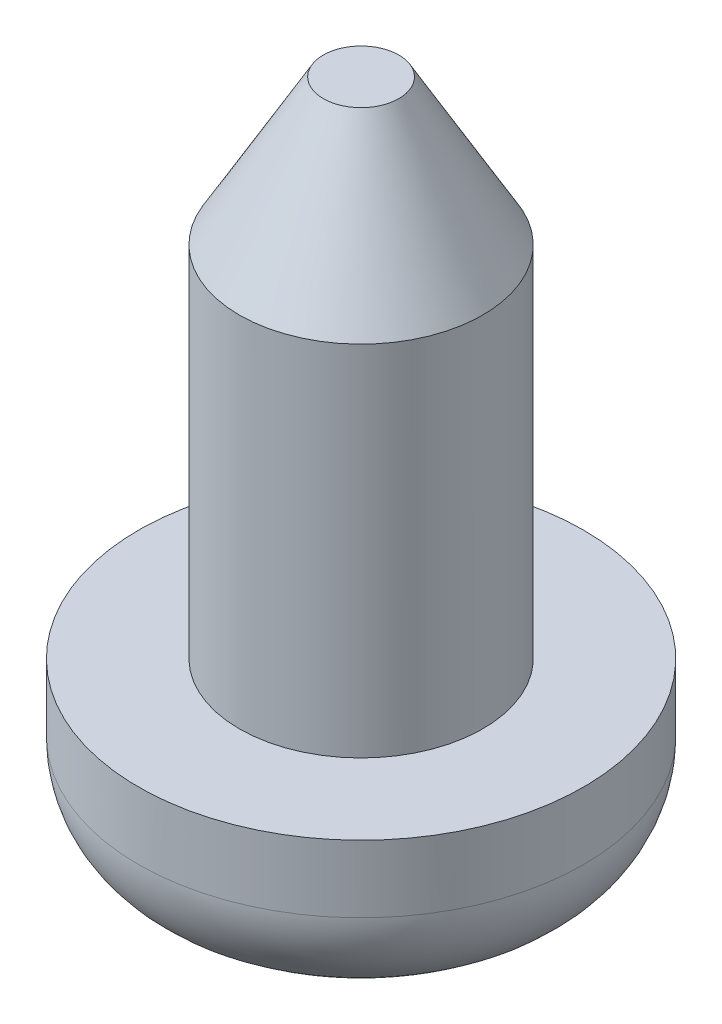
ISO-10303-21;
HEADER;
FILE_DESCRIPTION(('STEP AP214'),'2;1');
FILE_NAME('part.step','',(''),(''),'','','');
FILE_SCHEMA(('AUTOMOTIVE_DESIGN { 1 0 10303 214 1 1 1 1 }'));
ENDSEC;
DATA;
#1=APPLICATION_CONTEXT('core data for automotive mechanical design processes');
#2=APPLICATION_PROTOCOL_DEFINITION('international standard','automotive_design',2000,#1);
#3=PRODUCT_CONTEXT('',#1,'mechanical');
#4=PRODUCT('Part','Part','',(#3));
#5=PRODUCT_RELATED_PRODUCT_CATEGORY('part','',(#4));
#6=PRODUCT_DEFINITION_FORMATION('','',#4);
#7=PRODUCT_DEFINITION_CONTEXT('part definition',#1,'design');
#8=PRODUCT_DEFINITION('design','',#6,#7);
#9=PRODUCT_DEFINITION_SHAPE('','',#8);
#10=(LENGTH_UNIT() NAMED_UNIT(*) SI_UNIT(.MILLI.,.METRE.));
#11=(NAMED_UNIT(*) PLANE_ANGLE_UNIT() SI_UNIT($,.RADIAN.));
#12=(NAMED_UNIT(*) SI_UNIT($,.STERADIAN.) SOLID_ANGLE_UNIT());
#13=UNCERTAINTY_MEASURE_WITH_UNIT(LENGTH_MEASURE(1.E-05),#10,'distance_accuracy_value','');
#14=(GEOMETRIC_REPRESENTATION_CONTEXT(3) GLOBAL_UNCERTAINTY_ASSIGNED_CONTEXT((#13)) GLOBAL_UNIT_ASSIGNED_CONTEXT((#10,
#11,#12)) REPRESENTATION_CONTEXT('',''));
#15=CARTESIAN_POINT('',(0.,0.,0.));
#16=DIRECTION('',(0.,0.,1.));
#17=DIRECTION('',(1.,0.,0.));
#18=AXIS2_PLACEMENT_3D('',#15,#16,#17);
#19=CARTESIAN_POINT('',(-137.429096584287,-127.705426917511,-6.45095762802332));
#20=DIRECTION('',(0.978715860009591,0.,-0.20522004133536));
#21=DIRECTION('',(-0.20522004133536,0.,-0.978715860009591));
#22=AXIS2_PLACEMENT_3D('',#19,#20,#21);
#23=PLANE('',#22);
#24=DIRECTION('',(0.,1.,0.));
#25=VECTOR('',#24,1.);
#26=CARTESIAN_POINT('',(-137.313006597997,-127.705426917511,-5.8973123308491));
#27=LINE('',#26,#25);
#28=CARTESIAN_POINT('',(-137.313006597997,-128.705426917511,-5.89731233084906));
#29=VERTEX_POINT('',#28);
#30=CARTESIAN_POINT('',(-137.313006597997,-127.705426917511,-5.89731233084912));
#31=VERTEX_POINT('',#30);
#32=EDGE_CURVE('E557',#29,#31,#27,.T.);
#33=ORIENTED_EDGE('',*,*,#32,.T.);
#34=DIRECTION('',(-0.205220041333827,0.,-0.978715860009912));
#35=VECTOR('',#34,1.);
#36=CARTESIAN_POINT('',(-137.313006597997,-127.705426917511,-5.89731233084914));
#37=LINE('',#36,#35);
#38=CARTESIAN_POINT('',(-137.429096584287,-127.705426917511,-6.45095762802359));
#39=VERTEX_POINT('',#38);
#40=EDGE_CURVE('E555',#31,#39,#37,.T.);
#41=ORIENTED_EDGE('',*,*,#40,.T.);
#42=DIRECTION('',(0.,1.,0.));
#43=VECTOR('',#42,1.);
#44=CARTESIAN_POINT('',(-137.429096584288,-127.705426917511,-6.45095762802373));
#45=LINE('',#44,#43);
#46=CARTESIAN_POINT('',(-137.429096584287,-128.705426917511,-6.45095762802376));
#47=VERTEX_POINT('',#46);
#48=EDGE_CURVE('E540',#39,#47,#45,.F.);
#49=ORIENTED_EDGE('',*,*,#48,.T.);
#50=DIRECTION('',(-0.205220041333788,0.,-0.978715860009921));
#51=VECTOR('',#50,1.);
#52=CARTESIAN_POINT('',(-137.313006597997,-128.705426917511,-5.89731233084903));
#53=LINE('',#52,#51);
#54=EDGE_CURVE('E547',#29,#47,#53,.T.);
#55=ORIENTED_EDGE('',*,*,#54,.F.);
#56=EDGE_LOOP('',(#33,#41,#49,#55));
#57=FACE_BOUND('',#56,.T.);
#58=ADVANCED_FACE('F17',(#57),#23,.F.);
#59=CARTESIAN_POINT('',(-138.098831867752,-127.705426917511,-6.88851293890647));
#60=DIRECTION('',(-0.205220041335361,0.,-0.978715860009591));
#61=DIRECTION('',(-0.978715860009591,0.,0.205220041335361));
#62=AXIS2_PLACEMENT_3D('',#59,#60,#61);
#63=PLANE('',#62);
#64=DIRECTION('',(0.,1.,0.));
#65=VECTOR('',#64,1.);
#66=CARTESIAN_POINT('',(-138.098831867753,-127.705426917511,-6.8885129389066));
#67=LINE('',#66,#65);
#68=CARTESIAN_POINT('',(-138.098831867752,-128.705426917511,-6.88851293890631));
#69=VERTEX_POINT('',#68);
#70=CARTESIAN_POINT('',(-138.098831867752,-127.705426917511,-6.88851293890656));
#71=VERTEX_POINT('',#70);
#72=EDGE_CURVE('E140',#69,#71,#67,.T.);
#73=ORIENTED_EDGE('',*,*,#72,.T.);
#74=DIRECTION('',(-0.978715860009572,0.,0.205220041335452));
#75=VECTOR('',#74,1.);
#76=CARTESIAN_POINT('',(-138.098831867752,-127.705426917511,-6.88851293890647));
#77=LINE('',#76,#75);
#78=CARTESIAN_POINT('',(-138.652477164926,-127.705426917511,-6.77242295261554));
#79=VERTEX_POINT('',#78);
#80=EDGE_CURVE('E133',#71,#79,#77,.T.);
#81=ORIENTED_EDGE('',*,*,#80,.T.);
#82=DIRECTION('',(0.,1.,0.));
#83=VECTOR('',#82,1.);
#84=CARTESIAN_POINT('',(-138.652477164926,-127.705426917511,-6.77242295261554));
#85=LINE('',#84,#83);
#86=CARTESIAN_POINT('',(-138.652477164926,-128.705426917511,-6.77242295261556));
#87=VERTEX_POINT('',#86);
#88=EDGE_CURVE('E476',#79,#87,#85,.F.);
#89=ORIENTED_EDGE('',*,*,#88,.T.);
#90=DIRECTION('',(-0.978715860009706,0.,0.205220041334811));
#91=VECTOR('',#90,1.);
#92=CARTESIAN_POINT('',(-138.098831867752,-128.705426917511,-6.88851293890616));
#93=LINE('',#92,#91);
#94=EDGE_CURVE('E642',#69,#87,#93,.T.);
#95=ORIENTED_EDGE('',*,*,#94,.F.);
#96=EDGE_LOOP('',(#73,#81,#89,#95));
#97=FACE_BOUND('',#96,.T.);
#98=ADVANCED_FACE('F239',(#97),#63,.F.);
#99=CARTESIAN_POINT('',(-138.973942489519,-127.705426917511,-5.54904237197659));
#100=DIRECTION('',(-0.978715860009591,0.,0.20522004133536));
#101=DIRECTION('',(0.20522004133536,0.,0.978715860009591));
#102=AXIS2_PLACEMENT_3D('',#99,#100,#101);
#103=PLANE('',#102);
#104=DIRECTION('',(0.,1.,0.));
#105=VECTOR('',#104,1.);
#106=CARTESIAN_POINT('',(-139.09003247581,-127.705426917511,-6.10268766915057));
#107=LINE('',#106,#105);
#108=CARTESIAN_POINT('',(-139.09003247581,-128.705426917511,-6.10268766915057));
#109=VERTEX_POINT('',#108);
#110=CARTESIAN_POINT('',(-139.09003247581,-127.705426917511,-6.10268766915057));
#111=VERTEX_POINT('',#110);
#112=EDGE_CURVE('E628',#109,#111,#107,.T.);
#113=ORIENTED_EDGE('',*,*,#112,.T.);
#114=DIRECTION('',(0.20522004133559,0.,0.978715860009543));
#115=VECTOR('',#114,1.);
#116=CARTESIAN_POINT('',(-139.09003247581,-127.705426917511,-6.10268766915057));
#117=LINE('',#116,#115);
#118=CARTESIAN_POINT('',(-138.973942489519,-127.705426917511,-5.54904237197631));
#119=VERTEX_POINT('',#118);
#120=EDGE_CURVE('E598',#111,#119,#117,.T.);
#121=ORIENTED_EDGE('',*,*,#120,.T.);
#122=DIRECTION('',(0.,1.,0.));
#123=VECTOR('',#122,1.);
#124=CARTESIAN_POINT('',(-138.973942489518,-127.705426917511,-5.54904237197617));
#125=LINE('',#124,#123);
#126=CARTESIAN_POINT('',(-138.973942489519,-128.705426917511,-5.54904237197612));
#127=VERTEX_POINT('',#126);
#128=EDGE_CURVE('E392',#119,#127,#125,.F.);
#129=ORIENTED_EDGE('',*,*,#128,.T.);
#130=DIRECTION('',(0.205220041335483,0.,0.978715860009565));
#131=VECTOR('',#130,1.);
#132=CARTESIAN_POINT('',(-139.09003247581,-128.705426917511,-6.10268766915057));
#133=LINE('',#132,#131);
#134=EDGE_CURVE('E412',#109,#127,#133,.T.);
#135=ORIENTED_EDGE('',*,*,#134,.F.);
#136=EDGE_LOOP('',(#113,#121,#129,#135));
#137=FACE_BOUND('',#136,.T.);
#138=ADVANCED_FACE('F236',(#137),#103,.F.);
#139=CARTESIAN_POINT('',(-138.304207206054,-127.705426917511,-5.11148706109297));
#140=DIRECTION('',(0.205220041335361,0.,0.978715860009591));
#141=DIRECTION('',(0.978715860009591,0.,-0.205220041335361));
#142=AXIS2_PLACEMENT_3D('',#139,#140,#141);
#143=PLANE('',#142);
#144=DIRECTION('',(0.,1.,0.));
#145=VECTOR('',#144,1.);
#146=CARTESIAN_POINT('',(-138.304207206054,-127.705426917511,-5.11148706109309));
#147=LINE('',#146,#145);
#148=CARTESIAN_POINT('',(-138.304207206054,-128.705426917511,-5.11148706109301));
#149=VERTEX_POINT('',#148);
#150=CARTESIAN_POINT('',(-138.304207206054,-127.705426917511,-5.11148706109305));
#151=VERTEX_POINT('',#150);
#152=EDGE_CURVE('E601',#149,#151,#147,.T.);
#153=ORIENTED_EDGE('',*,*,#152,.T.);
#154=DIRECTION('',(0.978715860009522,0.,-0.205220041335688));
#155=VECTOR('',#154,1.);
#156=CARTESIAN_POINT('',(-138.304207206054,-127.705426917511,-5.11148706109297));
#157=LINE('',#156,#155);
#158=CARTESIAN_POINT('',(-137.75056190888,-127.705426917511,-5.22757704738404));
#159=VERTEX_POINT('',#158);
#160=EDGE_CURVE('E558',#151,#159,#157,.T.);
#161=ORIENTED_EDGE('',*,*,#160,.T.);
#162=DIRECTION('',(0.,1.,0.));
#163=VECTOR('',#162,1.);
#164=CARTESIAN_POINT('',(-137.75056190888,-127.705426917511,-5.22757704738404));
#165=LINE('',#164,#163);
#166=CARTESIAN_POINT('',(-137.75056190888,-128.705426917511,-5.22757704738403));
#167=VERTEX_POINT('',#166);
#168=EDGE_CURVE('E593',#159,#167,#165,.F.);
#169=ORIENTED_EDGE('',*,*,#168,.T.);
#170=DIRECTION('',(0.978715860009529,0.,-0.205220041335656));
#171=VECTOR('',#170,1.);
#172=CARTESIAN_POINT('',(-138.304207206054,-128.705426917511,-5.11148706109297));
#173=LINE('',#172,#171);
#174=EDGE_CURVE('E329',#149,#167,#173,.T.);
#175=ORIENTED_EDGE('',*,*,#174,.F.);
#176=EDGE_LOOP('',(#153,#161,#169,#175));
#177=FACE_BOUND('',#176,.T.);
#178=ADVANCED_FACE('F233',(#177),#143,.F.);
#179=CARTESIAN_POINT('',(-137.647874239729,-127.705426917511,-6.11608998629077));
#180=DIRECTION('',(0.,1.,0.));
#181=DIRECTION('',(0.,0.,1.));
#182=AXIS2_PLACEMENT_3D('',#179,#180,#181);
#183=PLANE('',#182);
#184=ORIENTED_EDGE('',*,*,#40,.F.);
#185=DIRECTION('',(-0.837169104331222,0.,-0.546944138603989));
#186=VECTOR('',#185,1.);
#187=CARTESIAN_POINT('',(-137.313006597997,-127.705426917511,-5.89731233084914));
#188=LINE('',#187,#186);
#189=CARTESIAN_POINT('',(-136.726988224965,-127.705426917511,-5.51445143382621));
#190=VERTEX_POINT('',#189);
#191=EDGE_CURVE('E562',#31,#190,#188,.F.);
#192=ORIENTED_EDGE('',*,*,#191,.T.);
#193=DIRECTION('',(0.546944138603991,0.,-0.837169104331221));
#194=VECTOR('',#193,1.);
#195=CARTESIAN_POINT('',(-136.726988224965,-127.705426917511,-5.51445143382596));
#196=LINE('',#195,#194);
#197=CARTESIAN_POINT('',(-137.164543535848,-127.705426917511,-4.84471615036132));
#198=VERTEX_POINT('',#197);
#199=EDGE_CURVE('E173',#190,#198,#196,.F.);
#200=ORIENTED_EDGE('',*,*,#199,.T.);
#201=DIRECTION('',(0.837169104331222,0.,0.546944138603989));
#202=VECTOR('',#201,1.);
#203=CARTESIAN_POINT('',(-137.75056190888,-127.705426917511,-5.22757704738404));
#204=LINE('',#203,#202);
#205=EDGE_CURVE('E216',#198,#159,#204,.F.);
#206=ORIENTED_EDGE('',*,*,#205,.T.);
#207=ORIENTED_EDGE('',*,*,#160,.F.);
#208=DIRECTION('',(0.546944138603986,0.,-0.837169104331224));
#209=VECTOR('',#208,1.);
#210=CARTESIAN_POINT('',(-138.687068103077,-127.705426917511,-4.52546868806121));
#211=LINE('',#210,#209);
#212=CARTESIAN_POINT('',(-138.687068103077,-127.705426917511,-4.52546868806139));
#213=VERTEX_POINT('',#212);
#214=EDGE_CURVE('E603',#151,#213,#211,.F.);
#215=ORIENTED_EDGE('',*,*,#214,.T.);
#216=DIRECTION('',(0.837169104331223,0.,0.546944138603987));
#217=VECTOR('',#216,1.);
#218=CARTESIAN_POINT('',(-139.356803386541,-127.705426917511,-4.96302399894454));
#219=LINE('',#218,#217);
#220=CARTESIAN_POINT('',(-139.356803386541,-127.705426917511,-4.96302399894454));
#221=VERTEX_POINT('',#220);
#222=EDGE_CURVE('E391',#213,#221,#219,.F.);
#223=ORIENTED_EDGE('',*,*,#222,.T.);
#224=DIRECTION('',(-0.546944138603987,0.,0.837169104331223));
#225=VECTOR('',#224,1.);
#226=CARTESIAN_POINT('',(-139.356803386541,-127.705426917511,-4.96302399894454));
#227=LINE('',#226,#225);
#228=EDGE_CURVE('E613',#221,#119,#227,.F.);
#229=ORIENTED_EDGE('',*,*,#228,.T.);
#230=ORIENTED_EDGE('',*,*,#120,.F.);
#231=DIRECTION('',(0.837169104331222,0.,0.546944138603989));
#232=VECTOR('',#231,1.);
#233=CARTESIAN_POINT('',(-139.09003247581,-127.705426917511,-6.10268766915057));
#234=LINE('',#233,#232);
#235=CARTESIAN_POINT('',(-139.676050848842,-127.705426917511,-6.48554856617326));
#236=VERTEX_POINT('',#235);
#237=EDGE_CURVE('E630',#111,#236,#234,.F.);
#238=ORIENTED_EDGE('',*,*,#237,.T.);
#239=DIRECTION('',(-0.546944138603991,0.,0.837169104331221));
#240=VECTOR('',#239,1.);
#241=CARTESIAN_POINT('',(-139.238495537958,-127.705426917511,-7.15528384963813));
#242=LINE('',#241,#240);
#243=CARTESIAN_POINT('',(-139.238495537958,-127.705426917511,-7.1552838496382));
#244=VERTEX_POINT('',#243);
#245=EDGE_CURVE('E475',#236,#244,#242,.F.);
#246=ORIENTED_EDGE('',*,*,#245,.T.);
#247=DIRECTION('',(-0.837169104331222,0.,-0.546944138603989));
#248=VECTOR('',#247,1.);
#249=CARTESIAN_POINT('',(-138.652477164926,-127.705426917511,-6.77242295261554));
#250=LINE('',#249,#248);
#251=EDGE_CURVE('E640',#244,#79,#250,.F.);
#252=ORIENTED_EDGE('',*,*,#251,.T.);
#253=ORIENTED_EDGE('',*,*,#80,.F.);
#254=DIRECTION('',(-0.546944138603986,0.,0.837169104331224));
#255=VECTOR('',#254,1.);
#256=CARTESIAN_POINT('',(-137.71597097073,-127.705426917511,-7.47453131193829));
#257=LINE('',#256,#255);
#258=CARTESIAN_POINT('',(-137.71597097073,-127.705426917511,-7.47453131193829));
#259=VERTEX_POINT('',#258);
#260=EDGE_CURVE('E516',#71,#259,#257,.F.);
#261=ORIENTED_EDGE('',*,*,#260,.T.);
#262=DIRECTION('',(-0.837169104331223,0.,-0.546944138603987));
#263=VECTOR('',#262,1.);
#264=CARTESIAN_POINT('',(-137.71597097073,-127.705426917511,-7.47453131193829));
#265=LINE('',#264,#263);
#266=CARTESIAN_POINT('',(-137.046235687265,-127.705426917511,-7.03697600105515));
#267=VERTEX_POINT('',#266);
#268=EDGE_CURVE('E520',#259,#267,#265,.F.);
#269=ORIENTED_EDGE('',*,*,#268,.T.);
#270=DIRECTION('',(0.546944138603987,0.,-0.837169104331223));
#271=VECTOR('',#270,1.);
#272=CARTESIAN_POINT('',(-137.046235687265,-127.705426917511,-7.03697600105531));
#273=LINE('',#272,#271);
#274=EDGE_CURVE('E543',#267,#39,#273,.F.);
#275=ORIENTED_EDGE('',*,*,#274,.T.);
#276=EDGE_LOOP('',(#184,#192,#200,#206,#207,#215,#223,#229,#230,#238,#246,#252,#253,#261,#269,#275));
#277=FACE_BOUND('',#276,.T.);
#278=ADVANCED_FACE('F228',(#277),#183,.F.);
#279=CARTESIAN_POINT('',(-137.313006597997,-127.705426917511,-5.89731233084914));
#280=DIRECTION('',(0.546944138603989,0.,-0.837169104331222));
#281=DIRECTION('',(-0.837169104331222,0.,-0.546944138603989));
#282=AXIS2_PLACEMENT_3D('',#279,#280,#281);
#283=PLANE('',#282);
#284=DIRECTION('',(0.,1.,0.));
#285=VECTOR('',#284,1.);
#286=CARTESIAN_POINT('',(-136.726988224965,-127.705426917511,-5.51445143382623));
#287=LINE('',#286,#285);
#288=CARTESIAN_POINT('',(-136.726988224965,-128.701048371783,-5.51445143382626));
#289=VERTEX_POINT('',#288);
#290=EDGE_CURVE('E190',#289,#190,#287,.T.);
#291=ORIENTED_EDGE('',*,*,#290,.T.);
#292=ORIENTED_EDGE('',*,*,#191,.F.);
#293=ORIENTED_EDGE('',*,*,#32,.F.);
#294=DIRECTION('',(-0.837169104331313,0.,-0.54694413860385));
#295=VECTOR('',#294,1.);
#296=CARTESIAN_POINT('',(-136.815949173989,-128.705426917511,-5.57257191316741));
#297=LINE('',#296,#295);
#298=CARTESIAN_POINT('',(-136.815949173989,-128.705426917511,-5.57257191316741));
#299=VERTEX_POINT('',#298);
#300=EDGE_CURVE('E198',#299,#29,#297,.T.);
#301=ORIENTED_EDGE('',*,*,#300,.F.);
#302=CARTESIAN_POINT('',(-136.726988224965,-128.701048371783,-5.51445143382628));
#303=CARTESIAN_POINT('',(-136.771275606335,-128.705426917511,-5.54338552077368));
#304=CARTESIAN_POINT('',(-136.815949173989,-128.705426917511,-5.5725719131674));
#305=B_SPLINE_CURVE_WITH_KNOTS('',2,(#302,#303,#304),.UNSPECIFIED.,.F.,.F.,(3,3),(0.,1.),.UNSPECIFIED.);
#306=EDGE_CURVE('E183',#289,#299,#305,.T.);
#307=ORIENTED_EDGE('',*,*,#306,.F.);
#308=EDGE_LOOP('',(#291,#292,#293,#301,#307));
#309=FACE_BOUND('',#308,.T.);
#310=ADVANCED_FACE('F196',(#309),#283,.F.);
#311=CARTESIAN_POINT('',(-138.201519536903,-128.705426917511,-5.99999999999977));
#312=DIRECTION('',(0.,-1.,0.));
#313=DIRECTION('',(0.,0.,-1.));
#314=AXIS2_PLACEMENT_3D('',#311,#312,#313);
#315=PLANE('',#314);
#316=ORIENTED_EDGE('',*,*,#300,.T.);
#317=ORIENTED_EDGE('',*,*,#54,.T.);
#318=DIRECTION('',(0.546944138603987,0.,-0.837169104331223));
#319=VECTOR('',#318,1.);
#320=CARTESIAN_POINT('',(-137.046235687265,-128.705426917511,-7.03697600105531));
#321=LINE('',#320,#319);
#322=CARTESIAN_POINT('',(-137.104356166606,-128.705426917511,-6.94801505203107));
#323=VERTEX_POINT('',#322);
#324=EDGE_CURVE('E80',#47,#323,#321,.T.);
#325=ORIENTED_EDGE('',*,*,#324,.T.);
#326=CARTESIAN_POINT('',(-138.201519536903,-128.705426917511,-5.99999999999977));
#327=DIRECTION('',(0.,1.,0.));
#328=DIRECTION('',(0.955565767527168,0.,0.294777990918954));
#329=AXIS2_PLACEMENT_3D('',#326,#327,#328);
#330=CIRCLE('',#329,1.44999999999957);
#331=EDGE_CURVE('E199',#299,#323,#330,.T.);
#332=ORIENTED_EDGE('',*,*,#331,.F.);
#333=EDGE_LOOP('',(#316,#317,#325,#332));
#334=FACE_BOUND('',#333,.T.);
#335=ADVANCED_FACE('F227',(#334),#315,.T.);
#336=CARTESIAN_POINT('',(-137.046235687265,-127.705426917511,-7.03697600105531));
#337=DIRECTION('',(0.837169104331223,0.,0.546944138603987));
#338=DIRECTION('',(0.546944138603987,0.,-0.837169104331223));
#339=AXIS2_PLACEMENT_3D('',#336,#337,#338);
#340=PLANE('',#339);
#341=ORIENTED_EDGE('',*,*,#324,.F.);
#342=ORIENTED_EDGE('',*,*,#48,.F.);
#343=ORIENTED_EDGE('',*,*,#274,.F.);
#344=DIRECTION('',(0.,1.,0.));
#345=VECTOR('',#344,1.);
#346=CARTESIAN_POINT('',(-137.046235687265,-127.705426917511,-7.03697600105515));
#347=LINE('',#346,#345);
#348=CARTESIAN_POINT('',(-137.046235687265,-128.701048371783,-7.03697600105516));
#349=VERTEX_POINT('',#348);
#350=EDGE_CURVE('E71',#267,#349,#347,.F.);
#351=ORIENTED_EDGE('',*,*,#350,.T.);
#352=CARTESIAN_POINT('',(-137.104356166606,-128.705426917511,-6.94801505203118));
#353=CARTESIAN_POINT('',(-137.075169774215,-128.705426917511,-6.9926886196819));
#354=CARTESIAN_POINT('',(-137.046235687265,-128.701048371783,-7.03697600105531));
#355=B_SPLINE_CURVE_WITH_KNOTS('',2,(#352,#353,#354),.UNSPECIFIED.,.F.,.F.,(3,3),(0.,1.),.UNSPECIFIED.);
#356=EDGE_CURVE('E201',#323,#349,#355,.T.);
#357=ORIENTED_EDGE('',*,*,#356,.F.);
#358=EDGE_LOOP('',(#341,#342,#343,#351,#357));
#359=FACE_BOUND('',#358,.T.);
#360=ADVANCED_FACE('F526',(#359),#340,.F.);
#361=CARTESIAN_POINT('',(-137.71597097073,-127.705426917511,-7.47453131193829));
#362=DIRECTION('',(0.546944138603987,0.,-0.837169104331223));
#363=DIRECTION('',(-0.837169104331223,0.,-0.546944138603987));
#364=AXIS2_PLACEMENT_3D('',#361,#362,#363);
#365=PLANE('',#364);
#366=ORIENTED_EDGE('',*,*,#350,.F.);
#367=ORIENTED_EDGE('',*,*,#268,.F.);
#368=DIRECTION('',(0.,1.,0.));
#369=VECTOR('',#368,1.);
#370=CARTESIAN_POINT('',(-137.71597097073,-127.705426917511,-7.47453131193829));
#371=LINE('',#370,#369);
#372=CARTESIAN_POINT('',(-137.71597097073,-128.701048371783,-7.47453131193833));
#373=VERTEX_POINT('',#372);
#374=EDGE_CURVE('E509',#259,#373,#371,.F.);
#375=ORIENTED_EDGE('',*,*,#374,.T.);
#376=CARTESIAN_POINT('',(-137.046235687265,-128.701048371783,-7.03697600105517));
#377=CARTESIAN_POINT('',(-137.074137927458,-128.701780812457,-7.05520525324351));
#378=CARTESIAN_POINT('',(-137.102042627356,-128.702341137003,-7.07343611242151));
#379=CARTESIAN_POINT('',(-137.157854117179,-128.703212528076,-7.10989919624461));
#380=CARTESIAN_POINT('',(-137.185760907029,-128.70352360118,-7.12813142084098));
#381=CARTESIAN_POINT('',(-137.269478840757,-128.704225408128,-7.18282650324634));
#382=CARTESIAN_POINT('',(-137.325291084877,-128.704384798339,-7.21929007987154));
#383=CARTESIAN_POINT('',(-137.436915573118,-128.704384798339,-7.29221723312192));
#384=CARTESIAN_POINT('',(-137.492727817239,-128.704225408128,-7.32868080974711));
#385=CARTESIAN_POINT('',(-137.576445750967,-128.70352360118,-7.38337589215247));
#386=CARTESIAN_POINT('',(-137.604352540816,-128.703212528076,-7.40160811674884));
#387=CARTESIAN_POINT('',(-137.660164030639,-128.702341137003,-7.43807120057195));
#388=CARTESIAN_POINT('',(-137.688068730538,-128.701780812457,-7.45630205974996));
#389=CARTESIAN_POINT('',(-137.71597097073,-128.701048371783,-7.47453131193831));
#390=B_SPLINE_CURVE_WITH_KNOTS('',3,(#376,#377,#378,#379,#380,#381,#382,#383,#384,#385,#386,
#387,#388,#389),.UNSPECIFIED.,.F.,.F.,(4,2,2,2,2,2,4),(0.,0.100010330135612,0.200018020854313,
0.400020729846273,0.600023438838254,0.700031129556985,0.800041459692609),.UNSPECIFIED.);
#391=EDGE_CURVE('E675',#349,#373,#390,.T.);
#392=ORIENTED_EDGE('',*,*,#391,.F.);
#393=EDGE_LOOP('',(#366,#367,#375,#392));
#394=FACE_BOUND('',#393,.T.);
#395=ADVANCED_FACE('F503',(#394),#365,.F.);
#396=CARTESIAN_POINT('',(-137.71597097073,-127.705426917511,-7.47453131193829));
#397=DIRECTION('',(-0.837169104331224,0.,-0.546944138603986));
#398=DIRECTION('',(-0.546944138603986,0.,0.837169104331224));
#399=AXIS2_PLACEMENT_3D('',#396,#397,#398);
#400=PLANE('',#399);
#401=ORIENTED_EDGE('',*,*,#374,.F.);
#402=ORIENTED_EDGE('',*,*,#260,.F.);
#403=ORIENTED_EDGE('',*,*,#72,.F.);
#404=DIRECTION('',(-0.546944138603215,0.,0.837169104331728));
#405=VECTOR('',#404,1.);
#406=CARTESIAN_POINT('',(-137.774091450071,-128.705426917511,-7.38557036291401));
#407=LINE('',#406,#405);
#408=CARTESIAN_POINT('',(-137.774091450071,-128.705426917511,-7.38557036291404));
#409=VERTEX_POINT('',#408);
#410=EDGE_CURVE('E488',#409,#69,#407,.T.);
#411=ORIENTED_EDGE('',*,*,#410,.F.);
#412=CARTESIAN_POINT('',(-137.71597097073,-128.701048371783,-7.47453131193833));
#413=CARTESIAN_POINT('',(-137.744905057677,-128.705426917511,-7.43024393056954));
#414=CARTESIAN_POINT('',(-137.774091450071,-128.705426917511,-7.38557036291416));
#415=B_SPLINE_CURVE_WITH_KNOTS('',2,(#412,#413,#414),.UNSPECIFIED.,.F.,.F.,(3,3),(0.,1.),.UNSPECIFIED.);
#416=EDGE_CURVE('E460',#373,#409,#415,.T.);
#417=ORIENTED_EDGE('',*,*,#416,.F.);
#418=EDGE_LOOP('',(#401,#402,#403,#411,#417));
#419=FACE_BOUND('',#418,.T.);
#420=ADVANCED_FACE('F499',(#419),#400,.F.);
#421=CARTESIAN_POINT('',(-138.201519536903,-128.705426917511,-5.99999999999977));
#422=DIRECTION('',(0.,-1.,0.));
#423=DIRECTION('',(0.,0.,-1.));
#424=AXIS2_PLACEMENT_3D('',#421,#422,#423);
#425=PLANE('',#424);
#426=DIRECTION('',(-0.837169104331222,0.,-0.546944138603989));
#427=VECTOR('',#426,1.);
#428=CARTESIAN_POINT('',(-138.652477164926,-128.705426917511,-6.77242295261554));
#429=LINE('',#428,#427);
#430=CARTESIAN_POINT('',(-139.149534588934,-128.705426917511,-7.09716337029712));
#431=VERTEX_POINT('',#430);
#432=EDGE_CURVE('E468',#87,#431,#429,.T.);
#433=ORIENTED_EDGE('',*,*,#432,.T.);
#434=CARTESIAN_POINT('',(-138.201519536903,-128.705426917511,-5.99999999999977));
#435=DIRECTION('',(0.,1.,0.));
#436=DIRECTION('',(0.294777990918659,0.,-0.955565767527259));
#437=AXIS2_PLACEMENT_3D('',#434,#435,#436);
#438=CIRCLE('',#437,1.44999999999969);
#439=EDGE_CURVE('E459',#409,#431,#438,.T.);
#440=ORIENTED_EDGE('',*,*,#439,.F.);
#441=ORIENTED_EDGE('',*,*,#410,.T.);
#442=ORIENTED_EDGE('',*,*,#94,.T.);
#443=EDGE_LOOP('',(#433,#440,#441,#442));
#444=FACE_BOUND('',#443,.T.);
#445=ADVANCED_FACE('F490',(#444),#425,.T.);
#446=CARTESIAN_POINT('',(-138.652477164926,-127.705426917511,-6.77242295261554));
#447=DIRECTION('',(0.546944138603989,0.,-0.837169104331222));
#448=DIRECTION('',(-0.837169104331222,0.,-0.546944138603989));
#449=AXIS2_PLACEMENT_3D('',#446,#447,#448);
#450=PLANE('',#449);
#451=ORIENTED_EDGE('',*,*,#432,.F.);
#452=ORIENTED_EDGE('',*,*,#88,.F.);
#453=ORIENTED_EDGE('',*,*,#251,.F.);
#454=DIRECTION('',(0.,1.,0.));
#455=VECTOR('',#454,1.);
#456=CARTESIAN_POINT('',(-139.238495537958,-127.705426917511,-7.15528384963813));
#457=LINE('',#456,#455);
#458=CARTESIAN_POINT('',(-139.238495537958,-128.701048371783,-7.15528384963816));
#459=VERTEX_POINT('',#458);
#460=EDGE_CURVE('E631',#244,#459,#457,.F.);
#461=ORIENTED_EDGE('',*,*,#460,.T.);
#462=CARTESIAN_POINT('',(-139.149534588934,-128.705426917511,-7.09716337029722));
#463=CARTESIAN_POINT('',(-139.194208156584,-128.705426917511,-7.12634976268827));
#464=CARTESIAN_POINT('',(-139.238495537958,-128.701048371783,-7.15528384963833));
#465=B_SPLINE_CURVE_WITH_KNOTS('',2,(#462,#463,#464),.UNSPECIFIED.,.F.,.F.,(3,3),(0.,1.),.UNSPECIFIED.);
#466=EDGE_CURVE('E455',#431,#459,#465,.T.);
#467=ORIENTED_EDGE('',*,*,#466,.F.);
#468=EDGE_LOOP('',(#451,#452,#453,#461,#467));
#469=FACE_BOUND('',#468,.T.);
#470=ADVANCED_FACE('F443',(#469),#450,.F.);
#471=CARTESIAN_POINT('',(-139.238495537958,-127.705426917511,-7.15528384963813));
#472=DIRECTION('',(-0.837169104331221,0.,-0.546944138603991));
#473=DIRECTION('',(-0.546944138603991,0.,0.837169104331221));
#474=AXIS2_PLACEMENT_3D('',#471,#472,#473);
#475=PLANE('',#474);
#476=CARTESIAN_POINT('',(-139.238495537958,-128.701048371783,-7.15528384963818));
#477=CARTESIAN_POINT('',(-139.256724790146,-128.701780812457,-7.12738160944576));
#478=CARTESIAN_POINT('',(-139.274955649324,-128.702341137003,-7.09947690954679));
#479=CARTESIAN_POINT('',(-139.311418733147,-128.703212528076,-7.04366541972396));
#480=CARTESIAN_POINT('',(-139.329650957744,-128.70352360118,-7.01575862987469));
#481=CARTESIAN_POINT('',(-139.384346040149,-128.704225408128,-6.93204069614656));
#482=CARTESIAN_POINT('',(-139.420809616774,-128.704384798339,-6.87622845202607));
#483=CARTESIAN_POINT('',(-139.493736770025,-128.704384798339,-6.76460396378508));
#484=CARTESIAN_POINT('',(-139.53020034665,-128.704225408128,-6.70879171966459));
#485=CARTESIAN_POINT('',(-139.584895429055,-128.70352360118,-6.62507378593644));
#486=CARTESIAN_POINT('',(-139.603127653652,-128.703212528076,-6.59716699608715));
#487=CARTESIAN_POINT('',(-139.639590737475,-128.702341137003,-6.54135550626429));
#488=CARTESIAN_POINT('',(-139.657821596653,-128.701780812457,-6.51345080636531));
#489=CARTESIAN_POINT('',(-139.676050848841,-128.701048371783,-6.4855485661729));
#490=B_SPLINE_CURVE_WITH_KNOTS('',3,(#476,#477,#478,#479,#480,#481,#482,#483,#484,#485,#486,
#487,#488,#489),.UNSPECIFIED.,.F.,.F.,(4,2,2,2,2,2,4),(0.,0.100010330135633,0.200018020854383,
0.400020729846427,0.600023438838535,0.70003112955731,0.800041459693022),.UNSPECIFIED.);
#491=CARTESIAN_POINT('',(-139.676050848842,-128.701048371783,-6.48554856617339));
#492=VERTEX_POINT('',#491);
#493=EDGE_CURVE('E448',#459,#492,#490,.T.);
#494=ORIENTED_EDGE('',*,*,#493,.F.);
#495=ORIENTED_EDGE('',*,*,#460,.F.);
#496=ORIENTED_EDGE('',*,*,#245,.F.);
#497=DIRECTION('',(0.,1.,0.));
#498=VECTOR('',#497,1.);
#499=CARTESIAN_POINT('',(-139.676050848842,-127.705426917511,-6.48554856617339));
#500=LINE('',#499,#498);
#501=EDGE_CURVE('E413',#236,#492,#500,.F.);
#502=ORIENTED_EDGE('',*,*,#501,.T.);
#503=EDGE_LOOP('',(#494,#495,#496,#502));
#504=FACE_BOUND('',#503,.T.);
#505=ADVANCED_FACE('F438',(#504),#475,.F.);
#506=CARTESIAN_POINT('',(-139.09003247581,-127.705426917511,-6.10268766915057));
#507=DIRECTION('',(-0.546944138603989,0.,0.837169104331222));
#508=DIRECTION('',(0.837169104331222,0.,0.546944138603989));
#509=AXIS2_PLACEMENT_3D('',#506,#507,#508);
#510=PLANE('',#509);
#511=ORIENTED_EDGE('',*,*,#501,.F.);
#512=ORIENTED_EDGE('',*,*,#237,.F.);
#513=ORIENTED_EDGE('',*,*,#112,.F.);
#514=DIRECTION('',(0.837169104331281,0.,0.546944138603898));
#515=VECTOR('',#514,1.);
#516=CARTESIAN_POINT('',(-139.587089899818,-128.705426917511,-6.42742808683225));
#517=LINE('',#516,#515);
#518=CARTESIAN_POINT('',(-139.587089899818,-128.705426917511,-6.42742808683226));
#519=VERTEX_POINT('',#518);
#520=EDGE_CURVE('E405',#519,#109,#517,.T.);
#521=ORIENTED_EDGE('',*,*,#520,.F.);
#522=CARTESIAN_POINT('',(-139.676050848842,-128.701048371783,-6.48554856617339));
#523=CARTESIAN_POINT('',(-139.631763467472,-128.705426917511,-6.45661447922602));
#524=CARTESIAN_POINT('',(-139.587089899818,-128.705426917511,-6.42742808683231));
#525=B_SPLINE_CURVE_WITH_KNOTS('',2,(#522,#523,#524),.UNSPECIFIED.,.F.,.F.,(3,3),(0.,1.),.UNSPECIFIED.);
#526=EDGE_CURVE('E454',#492,#519,#525,.T.);
#527=ORIENTED_EDGE('',*,*,#526,.F.);
#528=EDGE_LOOP('',(#511,#512,#513,#521,#527));
#529=FACE_BOUND('',#528,.T.);
#530=ADVANCED_FACE('F429',(#529),#510,.F.);
#531=CARTESIAN_POINT('',(-138.201519536903,-128.705426917511,-5.99999999999977));
#532=DIRECTION('',(0.,-1.,0.));
#533=DIRECTION('',(0.,0.,-1.));
#534=AXIS2_PLACEMENT_3D('',#531,#532,#533);
#535=PLANE('',#534);
#536=DIRECTION('',(-0.546944138603987,0.,0.837169104331223));
#537=VECTOR('',#536,1.);
#538=CARTESIAN_POINT('',(-139.356803386541,-128.705426917511,-4.96302399894454));
#539=LINE('',#538,#537);
#540=CARTESIAN_POINT('',(-139.2986829072,-128.705426917511,-5.05198494796853));
#541=VERTEX_POINT('',#540);
#542=EDGE_CURVE('E384',#127,#541,#539,.T.);
#543=ORIENTED_EDGE('',*,*,#542,.T.);
#544=CARTESIAN_POINT('',(-138.201519536903,-128.705426917511,-5.99999999999977));
#545=DIRECTION('',(0.,1.,0.));
#546=DIRECTION('',(-0.955565767527207,0.,-0.294777990918828));
#547=AXIS2_PLACEMENT_3D('',#544,#545,#546);
#548=CIRCLE('',#547,1.45000000000061);
#549=EDGE_CURVE('E400',#519,#541,#548,.T.);
#550=ORIENTED_EDGE('',*,*,#549,.F.);
#551=ORIENTED_EDGE('',*,*,#520,.T.);
#552=ORIENTED_EDGE('',*,*,#134,.T.);
#553=EDGE_LOOP('',(#543,#550,#551,#552));
#554=FACE_BOUND('',#553,.T.);
#555=ADVANCED_FACE('F374',(#554),#535,.T.);
#556=CARTESIAN_POINT('',(-139.356803386541,-127.705426917511,-4.96302399894454));
#557=DIRECTION('',(-0.837169104331223,0.,-0.546944138603987));
#558=DIRECTION('',(-0.546944138603987,0.,0.837169104331223));
#559=AXIS2_PLACEMENT_3D('',#556,#557,#558);
#560=PLANE('',#559);
#561=ORIENTED_EDGE('',*,*,#542,.F.);
#562=ORIENTED_EDGE('',*,*,#128,.F.);
#563=ORIENTED_EDGE('',*,*,#228,.F.);
#564=DIRECTION('',(0.,1.,0.));
#565=VECTOR('',#564,1.);
#566=CARTESIAN_POINT('',(-139.356803386541,-127.705426917511,-4.96302399894454));
#567=LINE('',#566,#565);
#568=CARTESIAN_POINT('',(-139.356803386542,-128.701048371783,-4.96302399894494));
#569=VERTEX_POINT('',#568);
#570=EDGE_CURVE('E604',#221,#569,#567,.F.);
#571=ORIENTED_EDGE('',*,*,#570,.T.);
#572=CARTESIAN_POINT('',(-139.2986829072,-128.705426917511,-5.05198494796858));
#573=CARTESIAN_POINT('',(-139.327869299591,-128.705426917511,-5.00731138031869));
#574=CARTESIAN_POINT('',(-139.356803386541,-128.701048371783,-4.96302399894408));
#575=B_SPLINE_CURVE_WITH_KNOTS('',2,(#572,#573,#574),.UNSPECIFIED.,.F.,.F.,(3,3),(0.,1.),.UNSPECIFIED.);
#576=EDGE_CURVE('E362',#541,#569,#575,.T.);
#577=ORIENTED_EDGE('',*,*,#576,.F.);
#578=EDGE_LOOP('',(#561,#562,#563,#571,#577));
#579=FACE_BOUND('',#578,.T.);
#580=ADVANCED_FACE('F369',(#579),#560,.F.);
#581=CARTESIAN_POINT('',(-139.356803386541,-127.705426917511,-4.96302399894454));
#582=DIRECTION('',(-0.546944138603987,0.,0.837169104331223));
#583=DIRECTION('',(0.837169104331223,0.,0.546944138603987));
#584=AXIS2_PLACEMENT_3D('',#581,#582,#583);
#585=PLANE('',#584);
#586=ORIENTED_EDGE('',*,*,#570,.F.);
#587=ORIENTED_EDGE('',*,*,#222,.F.);
#588=DIRECTION('',(0.,1.,0.));
#589=VECTOR('',#588,1.);
#590=CARTESIAN_POINT('',(-138.687068103077,-127.705426917511,-4.52546868806121));
#591=LINE('',#590,#589);
#592=CARTESIAN_POINT('',(-138.687068103077,-128.701048371783,-4.52546868806121));
#593=VERTEX_POINT('',#592);
#594=EDGE_CURVE('E330',#213,#593,#591,.F.);
#595=ORIENTED_EDGE('',*,*,#594,.T.);
#596=CARTESIAN_POINT('',(-139.356803386542,-128.701048371783,-4.96302399894488));
#597=CARTESIAN_POINT('',(-139.328901146349,-128.701780812457,-4.94479474675653));
#598=CARTESIAN_POINT('',(-139.30099644645,-128.702341137003,-4.92656388757853));
#599=CARTESIAN_POINT('',(-139.245184956627,-128.703212528076,-4.89010080375543));
#600=CARTESIAN_POINT('',(-139.217278166778,-128.70352360118,-4.87186857915906));
#601=CARTESIAN_POINT('',(-139.13356023305,-128.704225408128,-4.8171734967537));
#602=CARTESIAN_POINT('',(-139.07774798893,-128.704384798339,-4.78070992012851));
#603=CARTESIAN_POINT('',(-138.966123500689,-128.704384798339,-4.70778276687812));
#604=CARTESIAN_POINT('',(-138.910311256568,-128.704225408128,-4.67131919025293));
#605=CARTESIAN_POINT('',(-138.82659332284,-128.70352360118,-4.61662410784755));
#606=CARTESIAN_POINT('',(-138.798686532991,-128.703212528076,-4.59839188325118));
#607=CARTESIAN_POINT('',(-138.742875043168,-128.702341137003,-4.56192879942808));
#608=CARTESIAN_POINT('',(-138.714970343269,-128.701780812457,-4.5436979402501));
#609=CARTESIAN_POINT('',(-138.687068103077,-128.701048371783,-4.52546868806179));
#610=B_SPLINE_CURVE_WITH_KNOTS('',3,(#596,#597,#598,#599,#600,#601,#602,#603,#604,#605,#606,
#607,#608,#609),.UNSPECIFIED.,.F.,.F.,(4,2,2,2,2,2,4),(0.,0.100010330135639,0.20001802085434,
0.400020729846322,0.600023438838313,0.700031129557046,0.800041459692627),.UNSPECIFIED.);
#611=EDGE_CURVE('E356',#569,#593,#610,.T.);
#612=ORIENTED_EDGE('',*,*,#611,.F.);
#613=EDGE_LOOP('',(#586,#587,#595,#612));
#614=FACE_BOUND('',#613,.T.);
#615=ADVANCED_FACE('F365',(#614),#585,.F.);
#616=CARTESIAN_POINT('',(-138.687068103077,-127.705426917511,-4.52546868806121));
#617=DIRECTION('',(0.837169104331224,0.,0.546944138603986));
#618=DIRECTION('',(0.546944138603986,0.,-0.837169104331224));
#619=AXIS2_PLACEMENT_3D('',#616,#617,#618);
#620=PLANE('',#619);
#621=ORIENTED_EDGE('',*,*,#594,.F.);
#622=ORIENTED_EDGE('',*,*,#214,.F.);
#623=ORIENTED_EDGE('',*,*,#152,.F.);
#624=DIRECTION('',(0.546944138603239,0.,-0.837169104331712));
#625=VECTOR('',#624,1.);
#626=CARTESIAN_POINT('',(-138.628947623735,-128.705426917511,-4.61442963708511));
#627=LINE('',#626,#625);
#628=CARTESIAN_POINT('',(-138.628947623735,-128.705426917511,-4.61442963708519));
#629=VERTEX_POINT('',#628);
#630=EDGE_CURVE('E321',#629,#149,#627,.T.);
#631=ORIENTED_EDGE('',*,*,#630,.F.);
#632=CARTESIAN_POINT('',(-138.687068103077,-128.701048371783,-4.52546868806121));
#633=CARTESIAN_POINT('',(-138.65813401613,-128.705426917511,-4.56975606943124));
#634=CARTESIAN_POINT('',(-138.628947623736,-128.705426917511,-4.61442963708552));
#635=B_SPLINE_CURVE_WITH_KNOTS('',2,(#632,#633,#634),.UNSPECIFIED.,.F.,.F.,(3,3),(0.,1.),.UNSPECIFIED.);
#636=EDGE_CURVE('E354',#593,#629,#635,.T.);
#637=ORIENTED_EDGE('',*,*,#636,.F.);
#638=EDGE_LOOP('',(#621,#622,#623,#631,#637));
#639=FACE_BOUND('',#638,.T.);
#640=ADVANCED_FACE('F311',(#639),#620,.F.);
#641=CARTESIAN_POINT('',(-138.201519536903,-128.705426917511,-5.99999999999977));
#642=DIRECTION('',(0.,-1.,0.));
#643=DIRECTION('',(0.,0.,-1.));
#644=AXIS2_PLACEMENT_3D('',#641,#642,#643);
#645=PLANE('',#644);
#646=DIRECTION('',(0.837169104331222,0.,0.546944138603989));
#647=VECTOR('',#646,1.);
#648=CARTESIAN_POINT('',(-137.75056190888,-128.705426917511,-5.22757704738404));
#649=LINE('',#648,#647);
#650=CARTESIAN_POINT('',(-137.253504484872,-128.705426917511,-4.90283662970236));
#651=VERTEX_POINT('',#650);
#652=EDGE_CURVE('E194',#167,#651,#649,.T.);
#653=ORIENTED_EDGE('',*,*,#652,.T.);
#654=CARTESIAN_POINT('',(-138.201519536903,-128.705426917511,-5.99999999999977));
#655=DIRECTION('',(0.,1.,0.));
#656=DIRECTION('',(-0.29477799091861,0.,0.955565767527274));
#657=AXIS2_PLACEMENT_3D('',#654,#655,#656);
#658=CIRCLE('',#657,1.45000000000012);
#659=EDGE_CURVE('E335',#629,#651,#658,.T.);
#660=ORIENTED_EDGE('',*,*,#659,.F.);
#661=ORIENTED_EDGE('',*,*,#630,.T.);
#662=ORIENTED_EDGE('',*,*,#174,.T.);
#663=EDGE_LOOP('',(#653,#660,#661,#662));
#664=FACE_BOUND('',#663,.T.);
#665=ADVANCED_FACE('F306',(#664),#645,.T.);
#666=CARTESIAN_POINT('',(-137.75056190888,-127.705426917511,-5.22757704738404));
#667=DIRECTION('',(-0.546944138603989,0.,0.837169104331222));
#668=DIRECTION('',(0.837169104331222,0.,0.546944138603989));
#669=AXIS2_PLACEMENT_3D('',#666,#667,#668);
#670=PLANE('',#669);
#671=ORIENTED_EDGE('',*,*,#652,.F.);
#672=ORIENTED_EDGE('',*,*,#168,.F.);
#673=ORIENTED_EDGE('',*,*,#205,.F.);
#674=DIRECTION('',(0.,1.,0.));
#675=VECTOR('',#674,1.);
#676=CARTESIAN_POINT('',(-137.164543535848,-127.705426917511,-4.84471615036138));
#677=LINE('',#676,#675);
#678=CARTESIAN_POINT('',(-137.164543535848,-128.701048371783,-4.84471615036136));
#679=VERTEX_POINT('',#678);
#680=EDGE_CURVE('E37',#198,#679,#677,.F.);
#681=ORIENTED_EDGE('',*,*,#680,.T.);
#682=CARTESIAN_POINT('',(-137.253504484872,-128.705426917511,-4.90283662970234));
#683=CARTESIAN_POINT('',(-137.208830917222,-128.705426917511,-4.8736502373113));
#684=CARTESIAN_POINT('',(-137.164543535848,-128.701048371783,-4.84471615036124));
#685=B_SPLINE_CURVE_WITH_KNOTS('',2,(#682,#683,#684),.UNSPECIFIED.,.F.,.F.,(3,3),(0.,1.),.UNSPECIFIED.);
#686=EDGE_CURVE('E185',#651,#679,#685,.T.);
#687=ORIENTED_EDGE('',*,*,#686,.F.);
#688=EDGE_LOOP('',(#671,#672,#673,#681,#687));
#689=FACE_BOUND('',#688,.T.);
#690=ADVANCED_FACE('F297',(#689),#670,.F.);
#691=CARTESIAN_POINT('',(-136.726988224965,-127.705426917511,-5.51445143382596));
#692=DIRECTION('',(0.837169104331221,0.,0.546944138603991));
#693=DIRECTION('',(0.546944138603991,0.,-0.837169104331221));
#694=AXIS2_PLACEMENT_3D('',#691,#692,#693);
#695=PLANE('',#694);
#696=CARTESIAN_POINT('',(-137.164543535848,-128.701048371783,-4.84471615036134));
#697=CARTESIAN_POINT('',(-137.14631428366,-128.701780812457,-4.87261839055376));
#698=CARTESIAN_POINT('',(-137.128083424482,-128.702341137003,-4.90052309045272));
#699=CARTESIAN_POINT('',(-137.091620340658,-128.703212528076,-4.95633458027554));
#700=CARTESIAN_POINT('',(-137.073388116062,-128.70352360118,-4.98424137012481));
#701=CARTESIAN_POINT('',(-137.018693033657,-128.704225408128,-5.06795930385293));
#702=CARTESIAN_POINT('',(-136.982229457032,-128.704384798339,-5.12377154797344));
#703=CARTESIAN_POINT('',(-136.909302303781,-128.704384798339,-5.23539603621436));
#704=CARTESIAN_POINT('',(-136.872838727156,-128.704225408128,-5.29120828033478));
#705=CARTESIAN_POINT('',(-136.818143644751,-128.70352360118,-5.37492621406283));
#706=CARTESIAN_POINT('',(-136.799911420154,-128.703212528076,-5.40283300391209));
#707=CARTESIAN_POINT('',(-136.763448336331,-128.702341137003,-5.45864449373488));
#708=CARTESIAN_POINT('',(-136.745217477153,-128.701780812457,-5.48654919363383));
#709=CARTESIAN_POINT('',(-136.726988224965,-128.701048371783,-5.51445143382622));
#710=B_SPLINE_CURVE_WITH_KNOTS('',3,(#696,#697,#698,#699,#700,#701,#702,#703,#704,#705,#706,
#707,#708,#709),.UNSPECIFIED.,.F.,.F.,(4,2,2,2,2,2,4),(0.,0.100010330135639,0.20001802085438,
0.4000207298464,0.600023438838289,0.700031129556979,0.800041459692551),.UNSPECIFIED.);
#711=EDGE_CURVE('E178',#679,#289,#710,.T.);
#712=ORIENTED_EDGE('',*,*,#711,.F.);
#713=ORIENTED_EDGE('',*,*,#680,.F.);
#714=ORIENTED_EDGE('',*,*,#199,.F.);
#715=ORIENTED_EDGE('',*,*,#290,.F.);
#716=EDGE_LOOP('',(#712,#713,#714,#715));
#717=FACE_BOUND('',#716,.T.);
#718=ADVANCED_FACE('F191',(#717),#695,.F.);
#719=CARTESIAN_POINT('',(-138.201519536903,-127.505426917511,-5.99999999999977));
#720=DIRECTION('',(0.,-1.,0.));
#721=DIRECTION('',(-0.83716910433122,0.,-0.546944138603992));
#722=AXIS2_PLACEMENT_3D('',#719,#720,#721);
#723=TOROIDAL_SURFACE('',#722,1.44999999999999,1.2);
#724=CARTESIAN_POINT('',(-138.201519536903,-127.505426917511,-5.99999999999977));
#725=DIRECTION('',(0.,-1.,0.));
#726=DIRECTION('',(0.,0.,-1.));
#727=AXIS2_PLACEMENT_3D('',#724,#725,#726);
#728=CIRCLE('',#727,2.65000000000002);
#729=CARTESIAN_POINT('',(-138.201519536903,-127.505426917511,-8.64999999999979));
#730=VERTEX_POINT('',#729);
#731=EDGE_CURVE('E187',#730,#730,#728,.F.);
#732=ORIENTED_EDGE('',*,*,#731,.F.);
#733=EDGE_LOOP('',(#732));
#734=FACE_BOUND('',#733,.T.);
#735=ORIENTED_EDGE('',*,*,#686,.T.);
#736=ORIENTED_EDGE('',*,*,#711,.T.);
#737=ORIENTED_EDGE('',*,*,#306,.T.);
#738=ORIENTED_EDGE('',*,*,#331,.T.);
#739=ORIENTED_EDGE('',*,*,#356,.T.);
#740=ORIENTED_EDGE('',*,*,#391,.T.);
#741=ORIENTED_EDGE('',*,*,#416,.T.);
#742=ORIENTED_EDGE('',*,*,#439,.T.);
#743=ORIENTED_EDGE('',*,*,#466,.T.);
#744=ORIENTED_EDGE('',*,*,#493,.T.);
#745=ORIENTED_EDGE('',*,*,#526,.T.);
#746=ORIENTED_EDGE('',*,*,#549,.T.);
#747=ORIENTED_EDGE('',*,*,#576,.T.);
#748=ORIENTED_EDGE('',*,*,#611,.T.);
#749=ORIENTED_EDGE('',*,*,#636,.T.);
#750=ORIENTED_EDGE('',*,*,#659,.T.);
#751=EDGE_LOOP('',(#735,#736,#737,#738,#739,#740,#741,#742,#743,#744,#745,#746,#747,#748,#749,#750));
#752=FACE_BOUND('',#751,.T.);
#753=ADVANCED_FACE('F180',(#734,#752),#723,.T.);
#754=CARTESIAN_POINT('',(-138.201519536903,-120.705426917511,-5.99999999999947));
#755=DIRECTION('',(0.,-1.,0.));
#756=DIRECTION('',(0.,0.,-1.));
#757=AXIS2_PLACEMENT_3D('',#754,#755,#756);
#758=PLANE('',#757);
#759=CARTESIAN_POINT('',(-138.201519536903,-120.705426917539,-5.99999999999957));
#760=DIRECTION('',(0.,-1.,0.));
#761=DIRECTION('',(0.,0.,-1.));
#762=AXIS2_PLACEMENT_3D('',#759,#760,#761);
#763=CIRCLE('',#762,0.450000000002629);
#764=CARTESIAN_POINT('',(-138.201519536903,-120.705426917539,-6.45000000000219));
#765=VERTEX_POINT('',#764);
#766=EDGE_CURVE('E568',#765,#765,#763,.T.);
#767=ORIENTED_EDGE('',*,*,#766,.F.);
#768=EDGE_LOOP('',(#767));
#769=FACE_BOUND('',#768,.T.);
#770=ADVANCED_FACE('F267',(#769),#758,.F.);
#771=CARTESIAN_POINT('',(-138.201519536903,-128.705426917511,-5.99999999999977));
#772=DIRECTION('',(0.,-1.,0.));
#773=DIRECTION('',(0.,0.,-1.));
#774=AXIS2_PLACEMENT_3D('',#771,#772,#773);
#775=CYLINDRICAL_SURFACE('',#774,2.65000000000002);
#776=ORIENTED_EDGE('',*,*,#731,.T.);
#777=EDGE_LOOP('',(#776));
#778=FACE_BOUND('',#777,.T.);
#779=CARTESIAN_POINT('',(-138.201519536903,-126.705426917511,-5.99999999999977));
#780=DIRECTION('',(0.,-1.,0.));
#781=DIRECTION('',(0.,0.,-1.));
#782=AXIS2_PLACEMENT_3D('',#779,#780,#781);
#783=CIRCLE('',#782,2.65000000000002);
#784=CARTESIAN_POINT('',(-138.201519536903,-126.705426917511,-8.64999999999979));
#785=VERTEX_POINT('',#784);
#786=EDGE_CURVE('E565',#785,#785,#783,.T.);
#787=ORIENTED_EDGE('',*,*,#786,.T.);
#788=EDGE_LOOP('',(#787));
#789=FACE_BOUND('',#788,.T.);
#790=ADVANCED_FACE('F263',(#778,#789),#775,.T.);
#791=CARTESIAN_POINT('',(-138.201519536903,-122.43747772493,-5.99999999999958));
#792=DIRECTION('',(0.,-1.,0.));
#793=DIRECTION('',(0.,0.,-1.));
#794=AXIS2_PLACEMENT_3D('',#791,#792,#793);
#795=CONICAL_SURFACE('',#794,1.44999999992849,0.523598775610712);
#796=CARTESIAN_POINT('',(-138.201519536903,-122.43747772508,-5.99999999999947));
#797=DIRECTION('',(0.,1.,0.));
#798=DIRECTION('',(0.,0.,1.));
#799=AXIS2_PLACEMENT_3D('',#796,#797,#798);
#800=CIRCLE('',#799,1.45);
#801=CARTESIAN_POINT('',(-138.201519536903,-122.43747772508,-7.45000000001495));
#802=VERTEX_POINT('',#801);
#803=EDGE_CURVE('E28',#802,#802,#800,.F.);
#804=CARTESIAN_POINT('',(-138.201519536903,-120.705426917539,-6.45000000000219));
#805=CARTESIAN_POINT('',(-138.201519536903,-120.723469113451,-6.460416666669));
#806=CARTESIAN_POINT('',(-138.201519536903,-120.741511309362,-6.4708333333358));
#807=CARTESIAN_POINT('',(-138.201519536903,-120.777595701186,-6.49166666666939));
#808=CARTESIAN_POINT('',(-138.201519536903,-120.795637897098,-6.50208333333619));
#809=CARTESIAN_POINT('',(-138.201519536903,-120.831722288922,-6.52291666666979));
#810=CARTESIAN_POINT('',(-138.201519536903,-120.849764484834,-6.53333333333659));
#811=CARTESIAN_POINT('',(-138.201519536903,-120.885848876658,-6.55416666667019));
#812=CARTESIAN_POINT('',(-138.201519536903,-120.903891072569,-6.56458333333699));
#813=CARTESIAN_POINT('',(-138.201519536903,-120.939975464393,-6.58541666667059));
#814=CARTESIAN_POINT('',(-138.201519536903,-120.958017660305,-6.59583333333739));
#815=CARTESIAN_POINT('',(-138.201519536903,-120.994102052129,-6.61666666667099));
#816=CARTESIAN_POINT('',(-138.201519536903,-121.012144248041,-6.62708333333779));
#817=CARTESIAN_POINT('',(-138.201519536903,-121.048228639865,-6.64791666667139));
#818=CARTESIAN_POINT('',(-138.201519536903,-121.066270835776,-6.65833333333818));
#819=CARTESIAN_POINT('',(-138.201519536903,-121.1023552276,-6.67916666667178));
#820=CARTESIAN_POINT('',(-138.201519536903,-121.120397423512,-6.68958333333859));
#821=CARTESIAN_POINT('',(-138.201519536903,-121.156481815336,-6.71041666667218));
#822=CARTESIAN_POINT('',(-138.201519536903,-121.174524011248,-6.72083333333898));
#823=CARTESIAN_POINT('',(-138.201519536903,-121.210608403072,-6.74166666667258));
#824=CARTESIAN_POINT('',(-138.201519536903,-121.228650598983,-6.75208333333938));
#825=CARTESIAN_POINT('',(-138.201519536903,-121.264734990807,-6.77291666667298));
#826=CARTESIAN_POINT('',(-138.201519536903,-121.282777186719,-6.78333333333978));
#827=CARTESIAN_POINT('',(-138.201519536903,-121.318861578543,-6.80416666667338));
#828=CARTESIAN_POINT('',(-138.201519536903,-121.336903774455,-6.81458333334018));
#829=CARTESIAN_POINT('',(-138.201519536903,-121.372988166279,-6.83541666667378));
#830=CARTESIAN_POINT('',(-138.201519536903,-121.39103036219,-6.84583333334058));
#831=CARTESIAN_POINT('',(-138.201519536903,-121.427114754014,-6.86666666667418));
#832=CARTESIAN_POINT('',(-138.201519536903,-121.445156949926,-6.87708333334098));
#833=CARTESIAN_POINT('',(-138.201519536903,-121.48124134175,-6.89791666667458));
#834=CARTESIAN_POINT('',(-138.201519536903,-121.499283537662,-6.90833333334137));
#835=CARTESIAN_POINT('',(-138.201519536903,-121.535367929486,-6.92916666667497));
#836=CARTESIAN_POINT('',(-138.201519536903,-121.553410125397,-6.93958333334177));
#837=CARTESIAN_POINT('',(-138.201519536903,-121.589494517221,-6.96041666667537));
#838=CARTESIAN_POINT('',(-138.201519536903,-121.607536713133,-6.97083333334217));
#839=CARTESIAN_POINT('',(-138.201519536903,-121.643621104957,-6.99166666667577));
#840=CARTESIAN_POINT('',(-138.201519536903,-121.661663300869,-7.00208333334257));
#841=CARTESIAN_POINT('',(-138.201519536903,-121.697747692693,-7.02291666667617));
#842=CARTESIAN_POINT('',(-138.201519536903,-121.715789888604,-7.03333333334297));
#843=CARTESIAN_POINT('',(-138.201519536903,-121.751874280428,-7.05416666667657));
#844=CARTESIAN_POINT('',(-138.201519536903,-121.76991647634,-7.06458333334337));
#845=CARTESIAN_POINT('',(-138.201519536903,-121.806000868164,-7.08541666667697));
#846=CARTESIAN_POINT('',(-138.201519536903,-121.824043064076,-7.09583333334377));
#847=CARTESIAN_POINT('',(-138.201519536903,-121.8601274559,-7.11666666667736));
#848=CARTESIAN_POINT('',(-138.201519536903,-121.878169651811,-7.12708333334416));
#849=CARTESIAN_POINT('',(-138.201519536903,-121.914254043635,-7.14791666667776));
#850=CARTESIAN_POINT('',(-138.201519536903,-121.932296239547,-7.15833333334456));
#851=CARTESIAN_POINT('',(-138.201519536903,-121.968380631371,-7.17916666667816));
#852=CARTESIAN_POINT('',(-138.201519536903,-121.986422827283,-7.18958333334496));
#853=CARTESIAN_POINT('',(-138.201519536903,-122.022507219107,-7.21041666667856));
#854=CARTESIAN_POINT('',(-138.201519536903,-122.040549415018,-7.22083333334536));
#855=CARTESIAN_POINT('',(-138.201519536903,-122.076633806842,-7.24166666667896));
#856=CARTESIAN_POINT('',(-138.201519536903,-122.094676002754,-7.25208333334576));
#857=CARTESIAN_POINT('',(-138.201519536903,-122.130760394578,-7.27291666667936));
#858=CARTESIAN_POINT('',(-138.201519536903,-122.14880259049,-7.28333333334616));
#859=CARTESIAN_POINT('',(-138.201519536903,-122.184886982314,-7.30416666667976));
#860=CARTESIAN_POINT('',(-138.201519536903,-122.202929178225,-7.31458333334656));
#861=CARTESIAN_POINT('',(-138.201519536903,-122.239013570049,-7.33541666668016));
#862=CARTESIAN_POINT('',(-138.201519536903,-122.257055765961,-7.34583333334695));
#863=CARTESIAN_POINT('',(-138.201519536903,-122.293140157785,-7.36666666668055));
#864=CARTESIAN_POINT('',(-138.201519536903,-122.311182353697,-7.37708333334735));
#865=CARTESIAN_POINT('',(-138.201519536903,-122.347266745521,-7.39791666668095));
#866=CARTESIAN_POINT('',(-138.201519536903,-122.365308941432,-7.40833333334775));
#867=CARTESIAN_POINT('',(-138.201519536903,-122.401393333256,-7.42916666668135));
#868=CARTESIAN_POINT('',(-138.201519536903,-122.419435529168,-7.43958333334815));
#869=CARTESIAN_POINT('',(-138.201519536903,-122.43747772508,-7.45000000001495));
#870=B_SPLINE_CURVE_WITH_KNOTS('',3,(#804,#805,#806,#807,#808,#809,#810,#811,#812,#813,#814,
#815,#816,#817,#818,#819,#820,#821,#822,#823,#824,#825,#826,#827,#828,#829,#830,#831,#832,#833,
#834,#835,#836,#837,#838,#839,#840,#841,#842,#843,#844,#845,#846,#847,#848,#849,#850,#851,#852,
#853,#854,#855,#856,#857,#858,#859,#860,#861,#862,#863,#864,#865,#866,#867,#868,#869),
.UNSPECIFIED.,.F.,.F.,(4,2,2,2,2,2,2,2,2,2,2,2,2,2,2,2,2,2,2,2,2,2,2,2,2,2,2,2,2,2,2,2,4),(0.,
0.0624999999994421,0.124999999998897,0.187499999998351,0.249999999997805,0.31249999999726,
0.374999999996714,0.437499999996168,0.499999999995611,0.562499999995065,0.62499999999452,
0.687499999993974,0.749999999993428,0.812499999992883,0.874999999992337,0.937499999991791,
0.999999999991246,1.06249999999069,1.12499999999014,1.1874999999896,1.24999999998904,
1.31249999998849,1.37499999998795,1.4374999999874,1.49999999998686,1.5624999999863,
1.62499999998575,1.68749999998521,1.74999999998466,1.81249999998412,1.87499999998357,
1.93749999998302,1.99999999998247),.UNSPECIFIED.);
#871=EDGE_CURVE('BSEAM255',#765,#802,#870,.T.);
#872=ORIENTED_EDGE('',*,*,#766,.T.);
#873=ORIENTED_EDGE('',*,*,#803,.F.);
#874=ORIENTED_EDGE('',*,*,#871,.T.);
#875=ORIENTED_EDGE('',*,*,#871,.F.);
#876=EDGE_LOOP('',(#872,#874,#873,#875));
#877=FACE_BOUND('',#876,.T.);
#878=ADVANCED_FACE('F255',(#877),#795,.T.);
#879=CARTESIAN_POINT('',(-138.201519536903,-126.705426917511,-5.99999999999969));
#880=DIRECTION('',(0.,-1.,0.));
#881=DIRECTION('',(0.,0.,-1.));
#882=AXIS2_PLACEMENT_3D('',#879,#880,#881);
#883=PLANE('',#882);
#884=CARTESIAN_POINT('',(-138.201519536903,-126.705426917511,-5.99999999999947));
#885=DIRECTION('',(0.,1.,0.));
#886=DIRECTION('',(0.,0.,1.));
#887=AXIS2_PLACEMENT_3D('',#884,#885,#886);
#888=CIRCLE('',#887,1.45);
#889=CARTESIAN_POINT('',(-138.201519536903,-126.705426917511,-4.54999999999947));
#890=VERTEX_POINT('',#889);
#891=EDGE_CURVE('E11',#890,#890,#888,.T.);
#892=ORIENTED_EDGE('',*,*,#891,.F.);
#893=EDGE_LOOP('',(#892));
#894=FACE_BOUND('',#893,.T.);
#895=ORIENTED_EDGE('',*,*,#786,.F.);
#896=EDGE_LOOP('',(#895));
#897=FACE_BOUND('',#896,.T.);
#898=ADVANCED_FACE('F249',(#894,#897),#883,.F.);
#899=CARTESIAN_POINT('',(-138.201519536903,-120.705426917511,-5.99999999999947));
#900=DIRECTION('',(0.,1.,0.));
#901=DIRECTION('',(0.,0.,1.));
#902=AXIS2_PLACEMENT_3D('',#899,#900,#901);
#903=CYLINDRICAL_SURFACE('',#902,1.45);
#904=ORIENTED_EDGE('',*,*,#803,.T.);
#905=EDGE_LOOP('',(#904));
#906=FACE_BOUND('',#905,.T.);
#907=ORIENTED_EDGE('',*,*,#891,.T.);
#908=EDGE_LOOP('',(#907));
#909=FACE_BOUND('',#908,.T.);
#910=ADVANCED_FACE('F247',(#906,#909),#903,.T.);
#911=CLOSED_SHELL('',(#58,#98,#138,#178,#278,#310,#335,#360,#395,#420,#445,#470,#505,#530,#555,
#580,#615,#640,#665,#690,#718,#753,#770,#790,#878,#898,#910));
#912=MANIFOLD_SOLID_BREP('B1',#911);
#913=ADVANCED_BREP_SHAPE_REPRESENTATION('',(#18,#912),#14);
#914=SHAPE_DEFINITION_REPRESENTATION(#9,#913);
ENDSEC;
END-ISO-10303-21;
